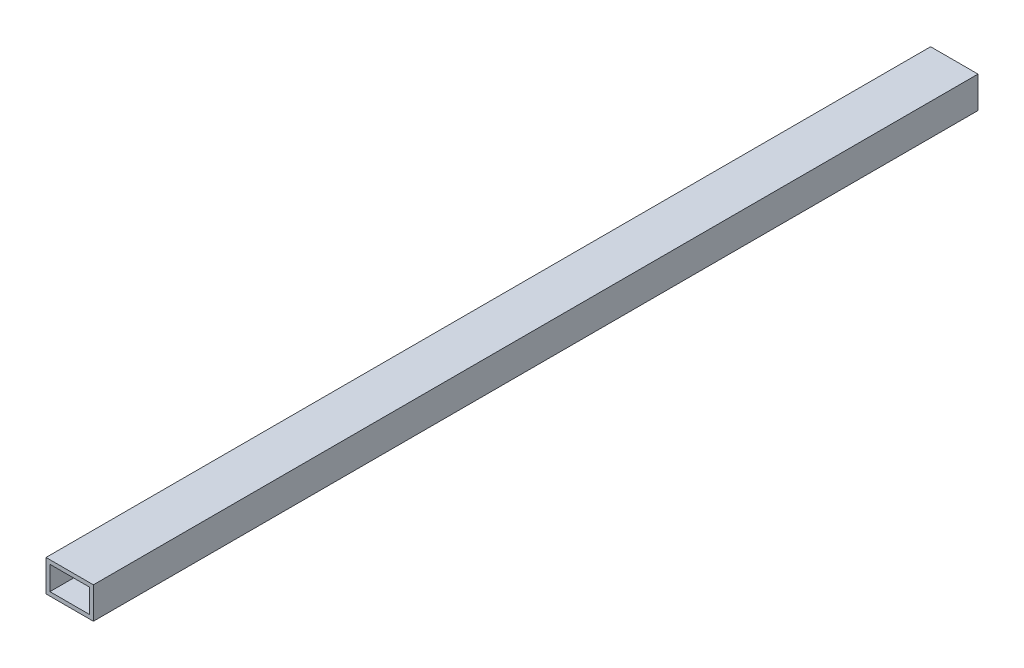
ISO-10303-21;
HEADER;
FILE_DESCRIPTION(('STEP AP214'),'2;1');
FILE_NAME('part.step','',(''),(''),'','','');
FILE_SCHEMA(('AUTOMOTIVE_DESIGN { 1 0 10303 214 1 1 1 1 }'));
ENDSEC;
DATA;
#1=APPLICATION_CONTEXT('core data for automotive mechanical design processes');
#2=APPLICATION_PROTOCOL_DEFINITION('international standard','automotive_design',2000,#1);
#3=PRODUCT_CONTEXT('',#1,'mechanical');
#4=PRODUCT('Part','Part','',(#3));
#5=PRODUCT_RELATED_PRODUCT_CATEGORY('part','',(#4));
#6=PRODUCT_DEFINITION_FORMATION('','',#4);
#7=PRODUCT_DEFINITION_CONTEXT('part definition',#1,'design');
#8=PRODUCT_DEFINITION('design','',#6,#7);
#9=PRODUCT_DEFINITION_SHAPE('','',#8);
#10=(LENGTH_UNIT() NAMED_UNIT(*) SI_UNIT(.MILLI.,.METRE.));
#11=(NAMED_UNIT(*) PLANE_ANGLE_UNIT() SI_UNIT($,.RADIAN.));
#12=(NAMED_UNIT(*) SI_UNIT($,.STERADIAN.) SOLID_ANGLE_UNIT());
#13=UNCERTAINTY_MEASURE_WITH_UNIT(LENGTH_MEASURE(1.E-05),#10,'distance_accuracy_value','');
#14=(GEOMETRIC_REPRESENTATION_CONTEXT(3) GLOBAL_UNCERTAINTY_ASSIGNED_CONTEXT((#13)) GLOBAL_UNIT_ASSIGNED_CONTEXT((#10,
#11,#12)) REPRESENTATION_CONTEXT('',''));
#15=CARTESIAN_POINT('',(0.,0.,0.));
#16=DIRECTION('',(0.,0.,1.));
#17=DIRECTION('',(1.,0.,0.));
#18=AXIS2_PLACEMENT_3D('',#15,#16,#17);
#19=CARTESIAN_POINT('',(19.05,12.7,711.2));
#20=DIRECTION('',(-1.,0.,0.));
#21=DIRECTION('',(0.,-1.,0.));
#22=AXIS2_PLACEMENT_3D('',#19,#20,#21);
#23=PLANE('',#22);
#24=DIRECTION('',(0.,1.,0.));
#25=VECTOR('',#24,1.);
#26=CARTESIAN_POINT('',(19.05,12.7,0.));
#27=LINE('',#26,#25);
#28=CARTESIAN_POINT('',(19.05,-12.7,0.));
#29=VERTEX_POINT('',#28);
#30=CARTESIAN_POINT('',(19.05,12.7,0.));
#31=VERTEX_POINT('',#30);
#32=EDGE_CURVE('E145',#29,#31,#27,.T.);
#33=ORIENTED_EDGE('',*,*,#32,.T.);
#34=DIRECTION('',(0.,0.,-1.));
#35=VECTOR('',#34,1.);
#36=CARTESIAN_POINT('',(19.05,12.7,711.2));
#37=LINE('',#36,#35);
#38=CARTESIAN_POINT('',(19.05,12.7,711.2));
#39=VERTEX_POINT('',#38);
#40=EDGE_CURVE('E11',#39,#31,#37,.T.);
#41=ORIENTED_EDGE('',*,*,#40,.F.);
#42=DIRECTION('',(0.,1.,0.));
#43=VECTOR('',#42,1.);
#44=CARTESIAN_POINT('',(19.05,12.7,711.2));
#45=LINE('',#44,#43);
#46=CARTESIAN_POINT('',(19.05,-12.7,711.2));
#47=VERTEX_POINT('',#46);
#48=EDGE_CURVE('E134',#47,#39,#45,.T.);
#49=ORIENTED_EDGE('',*,*,#48,.F.);
#50=DIRECTION('',(0.,0.,-1.));
#51=VECTOR('',#50,1.);
#52=CARTESIAN_POINT('',(19.05,-12.7,711.2));
#53=LINE('',#52,#51);
#54=EDGE_CURVE('E144',#47,#29,#53,.T.);
#55=ORIENTED_EDGE('',*,*,#54,.T.);
#56=EDGE_LOOP('',(#33,#41,#49,#55));
#57=FACE_BOUND('',#56,.T.);
#58=ADVANCED_FACE('F37',(#57),#23,.F.);
#59=CARTESIAN_POINT('',(-19.05,12.7,711.2));
#60=DIRECTION('',(0.,-1.,0.));
#61=DIRECTION('',(0.,0.,-1.));
#62=AXIS2_PLACEMENT_3D('',#59,#60,#61);
#63=PLANE('',#62);
#64=DIRECTION('',(-1.,0.,0.));
#65=VECTOR('',#64,1.);
#66=CARTESIAN_POINT('',(-19.05,12.7,0.));
#67=LINE('',#66,#65);
#68=CARTESIAN_POINT('',(-19.05,12.7,0.));
#69=VERTEX_POINT('',#68);
#70=EDGE_CURVE('E148',#31,#69,#67,.T.);
#71=ORIENTED_EDGE('',*,*,#70,.T.);
#72=DIRECTION('',(0.,0.,-1.));
#73=VECTOR('',#72,1.);
#74=CARTESIAN_POINT('',(-19.05,12.7,711.2));
#75=LINE('',#74,#73);
#76=CARTESIAN_POINT('',(-19.05,12.7,711.2));
#77=VERTEX_POINT('',#76);
#78=EDGE_CURVE('E44',#77,#69,#75,.T.);
#79=ORIENTED_EDGE('',*,*,#78,.F.);
#80=DIRECTION('',(-1.,0.,0.));
#81=VECTOR('',#80,1.);
#82=CARTESIAN_POINT('',(-19.05,12.7,711.2));
#83=LINE('',#82,#81);
#84=EDGE_CURVE('E137',#39,#77,#83,.T.);
#85=ORIENTED_EDGE('',*,*,#84,.F.);
#86=ORIENTED_EDGE('',*,*,#40,.T.);
#87=EDGE_LOOP('',(#71,#79,#85,#86));
#88=FACE_BOUND('',#87,.T.);
#89=ADVANCED_FACE('F176',(#88),#63,.F.);
#90=CARTESIAN_POINT('',(-19.05,12.7,711.2));
#91=DIRECTION('',(1.,0.,0.));
#92=DIRECTION('',(0.,1.,0.));
#93=AXIS2_PLACEMENT_3D('',#90,#91,#92);
#94=PLANE('',#93);
#95=DIRECTION('',(0.,-1.,0.));
#96=VECTOR('',#95,1.);
#97=CARTESIAN_POINT('',(-19.05,12.7,0.));
#98=LINE('',#97,#96);
#99=CARTESIAN_POINT('',(-19.05,-12.7,0.));
#100=VERTEX_POINT('',#99);
#101=EDGE_CURVE('E150',#69,#100,#98,.T.);
#102=ORIENTED_EDGE('',*,*,#101,.T.);
#103=DIRECTION('',(0.,0.,-1.));
#104=VECTOR('',#103,1.);
#105=CARTESIAN_POINT('',(-19.05,-12.7,711.2));
#106=LINE('',#105,#104);
#107=CARTESIAN_POINT('',(-19.05,-12.7,711.2));
#108=VERTEX_POINT('',#107);
#109=EDGE_CURVE('E155',#108,#100,#106,.T.);
#110=ORIENTED_EDGE('',*,*,#109,.F.);
#111=DIRECTION('',(0.,-1.,0.));
#112=VECTOR('',#111,1.);
#113=CARTESIAN_POINT('',(-19.05,12.7,711.2));
#114=LINE('',#113,#112);
#115=EDGE_CURVE('E140',#77,#108,#114,.T.);
#116=ORIENTED_EDGE('',*,*,#115,.F.);
#117=ORIENTED_EDGE('',*,*,#78,.T.);
#118=EDGE_LOOP('',(#102,#110,#116,#117));
#119=FACE_BOUND('',#118,.T.);
#120=ADVANCED_FACE('F162',(#119),#94,.F.);
#121=CARTESIAN_POINT('',(-19.05,-12.7,711.2));
#122=DIRECTION('',(0.,1.,0.));
#123=DIRECTION('',(0.,0.,1.));
#124=AXIS2_PLACEMENT_3D('',#121,#122,#123);
#125=PLANE('',#124);
#126=DIRECTION('',(1.,0.,0.));
#127=VECTOR('',#126,1.);
#128=CARTESIAN_POINT('',(-19.05,-12.7,0.));
#129=LINE('',#128,#127);
#130=EDGE_CURVE('E138',#100,#29,#129,.T.);
#131=ORIENTED_EDGE('',*,*,#130,.T.);
#132=ORIENTED_EDGE('',*,*,#54,.F.);
#133=DIRECTION('',(1.,0.,0.));
#134=VECTOR('',#133,1.);
#135=CARTESIAN_POINT('',(-19.05,-12.7,711.2));
#136=LINE('',#135,#134);
#137=EDGE_CURVE('E142',#108,#47,#136,.T.);
#138=ORIENTED_EDGE('',*,*,#137,.F.);
#139=ORIENTED_EDGE('',*,*,#109,.T.);
#140=EDGE_LOOP('',(#131,#132,#138,#139));
#141=FACE_BOUND('',#140,.T.);
#142=ADVANCED_FACE('F169',(#141),#125,.F.);
#143=CARTESIAN_POINT('',(0.,0.,711.2));
#144=DIRECTION('',(0.,0.,1.));
#145=DIRECTION('',(1.,0.,0.));
#146=AXIS2_PLACEMENT_3D('',#143,#144,#145);
#147=PLANE('',#146);
#148=DIRECTION('',(0.,1.,0.));
#149=VECTOR('',#148,1.);
#150=CARTESIAN_POINT('',(15.875,12.7,711.2));
#151=LINE('',#150,#149);
#152=CARTESIAN_POINT('',(15.875,-9.525,711.2));
#153=VERTEX_POINT('',#152);
#154=CARTESIAN_POINT('',(15.875,9.525,711.2));
#155=VERTEX_POINT('',#154);
#156=EDGE_CURVE('E122',#153,#155,#151,.T.);
#157=ORIENTED_EDGE('',*,*,#156,.F.);
#158=DIRECTION('',(1.,0.,0.));
#159=VECTOR('',#158,1.);
#160=CARTESIAN_POINT('',(-19.05,-9.525,711.2));
#161=LINE('',#160,#159);
#162=CARTESIAN_POINT('',(-15.875,-9.525,711.2));
#163=VERTEX_POINT('',#162);
#164=EDGE_CURVE('E106',#163,#153,#161,.T.);
#165=ORIENTED_EDGE('',*,*,#164,.F.);
#166=DIRECTION('',(0.,-1.,0.));
#167=VECTOR('',#166,1.);
#168=CARTESIAN_POINT('',(-15.875,12.7,711.2));
#169=LINE('',#168,#167);
#170=CARTESIAN_POINT('',(-15.875,9.525,711.2));
#171=VERTEX_POINT('',#170);
#172=EDGE_CURVE('E131',#171,#163,#169,.T.);
#173=ORIENTED_EDGE('',*,*,#172,.F.);
#174=DIRECTION('',(-1.,0.,0.));
#175=VECTOR('',#174,1.);
#176=CARTESIAN_POINT('',(-19.05,9.525,711.2));
#177=LINE('',#176,#175);
#178=EDGE_CURVE('E124',#155,#171,#177,.T.);
#179=ORIENTED_EDGE('',*,*,#178,.F.);
#180=EDGE_LOOP('',(#157,#165,#173,#179));
#181=FACE_BOUND('',#180,.T.);
#182=ORIENTED_EDGE('',*,*,#48,.T.);
#183=ORIENTED_EDGE('',*,*,#84,.T.);
#184=ORIENTED_EDGE('',*,*,#115,.T.);
#185=ORIENTED_EDGE('',*,*,#137,.T.);
#186=EDGE_LOOP('',(#182,#183,#184,#185));
#187=FACE_BOUND('',#186,.T.);
#188=ADVANCED_FACE('F175',(#181,#187),#147,.T.);
#189=CARTESIAN_POINT('',(0.,0.,0.));
#190=DIRECTION('',(0.,0.,1.));
#191=DIRECTION('',(1.,0.,0.));
#192=AXIS2_PLACEMENT_3D('',#189,#190,#191);
#193=PLANE('',#192);
#194=DIRECTION('',(1.,0.,0.));
#195=VECTOR('',#194,1.);
#196=CARTESIAN_POINT('',(-19.05,-9.525,0.));
#197=LINE('',#196,#195);
#198=CARTESIAN_POINT('',(-15.875,-9.525,0.));
#199=VERTEX_POINT('',#198);
#200=CARTESIAN_POINT('',(15.875,-9.525,0.));
#201=VERTEX_POINT('',#200);
#202=EDGE_CURVE('E104',#199,#201,#197,.T.);
#203=ORIENTED_EDGE('',*,*,#202,.T.);
#204=DIRECTION('',(0.,1.,0.));
#205=VECTOR('',#204,1.);
#206=CARTESIAN_POINT('',(15.875,12.7,0.));
#207=LINE('',#206,#205);
#208=CARTESIAN_POINT('',(15.875,9.525,0.));
#209=VERTEX_POINT('',#208);
#210=EDGE_CURVE('E112',#201,#209,#207,.T.);
#211=ORIENTED_EDGE('',*,*,#210,.T.);
#212=DIRECTION('',(-1.,0.,0.));
#213=VECTOR('',#212,1.);
#214=CARTESIAN_POINT('',(-19.05,9.525,0.));
#215=LINE('',#214,#213);
#216=CARTESIAN_POINT('',(-15.875,9.525,0.));
#217=VERTEX_POINT('',#216);
#218=EDGE_CURVE('E118',#209,#217,#215,.T.);
#219=ORIENTED_EDGE('',*,*,#218,.T.);
#220=DIRECTION('',(0.,-1.,0.));
#221=VECTOR('',#220,1.);
#222=CARTESIAN_POINT('',(-15.875,12.7,0.));
#223=LINE('',#222,#221);
#224=EDGE_CURVE('E58',#217,#199,#223,.T.);
#225=ORIENTED_EDGE('',*,*,#224,.T.);
#226=EDGE_LOOP('',(#203,#211,#219,#225));
#227=FACE_BOUND('',#226,.T.);
#228=ORIENTED_EDGE('',*,*,#32,.F.);
#229=ORIENTED_EDGE('',*,*,#130,.F.);
#230=ORIENTED_EDGE('',*,*,#101,.F.);
#231=ORIENTED_EDGE('',*,*,#70,.F.);
#232=EDGE_LOOP('',(#228,#229,#230,#231));
#233=FACE_BOUND('',#232,.T.);
#234=ADVANCED_FACE('F120',(#227,#233),#193,.F.);
#235=CARTESIAN_POINT('',(15.875,12.7,711.2));
#236=DIRECTION('',(-1.,0.,0.));
#237=DIRECTION('',(0.,-1.,0.));
#238=AXIS2_PLACEMENT_3D('',#235,#236,#237);
#239=PLANE('',#238);
#240=ORIENTED_EDGE('',*,*,#210,.F.);
#241=DIRECTION('',(0.,0.,-1.));
#242=VECTOR('',#241,1.);
#243=CARTESIAN_POINT('',(15.875,-9.525,711.2));
#244=LINE('',#243,#242);
#245=EDGE_CURVE('E100',#153,#201,#244,.T.);
#246=ORIENTED_EDGE('',*,*,#245,.F.);
#247=ORIENTED_EDGE('',*,*,#156,.T.);
#248=DIRECTION('',(0.,0.,-1.));
#249=VECTOR('',#248,1.);
#250=CARTESIAN_POINT('',(15.875,9.525,711.2));
#251=LINE('',#250,#249);
#252=EDGE_CURVE('E115',#155,#209,#251,.T.);
#253=ORIENTED_EDGE('',*,*,#252,.T.);
#254=EDGE_LOOP('',(#240,#246,#247,#253));
#255=FACE_BOUND('',#254,.T.);
#256=ADVANCED_FACE('F113',(#255),#239,.T.);
#257=CARTESIAN_POINT('',(-19.05,9.525,711.2));
#258=DIRECTION('',(0.,-1.,0.));
#259=DIRECTION('',(0.,0.,-1.));
#260=AXIS2_PLACEMENT_3D('',#257,#258,#259);
#261=PLANE('',#260);
#262=ORIENTED_EDGE('',*,*,#218,.F.);
#263=ORIENTED_EDGE('',*,*,#252,.F.);
#264=ORIENTED_EDGE('',*,*,#178,.T.);
#265=DIRECTION('',(0.,0.,-1.));
#266=VECTOR('',#265,1.);
#267=CARTESIAN_POINT('',(-15.875,9.525,711.2));
#268=LINE('',#267,#266);
#269=EDGE_CURVE('E280',#171,#217,#268,.T.);
#270=ORIENTED_EDGE('',*,*,#269,.T.);
#271=EDGE_LOOP('',(#262,#263,#264,#270));
#272=FACE_BOUND('',#271,.T.);
#273=ADVANCED_FACE('F196',(#272),#261,.T.);
#274=CARTESIAN_POINT('',(-15.875,12.7,711.2));
#275=DIRECTION('',(1.,0.,0.));
#276=DIRECTION('',(0.,1.,0.));
#277=AXIS2_PLACEMENT_3D('',#274,#275,#276);
#278=PLANE('',#277);
#279=ORIENTED_EDGE('',*,*,#224,.F.);
#280=ORIENTED_EDGE('',*,*,#269,.F.);
#281=ORIENTED_EDGE('',*,*,#172,.T.);
#282=DIRECTION('',(0.,0.,-1.));
#283=VECTOR('',#282,1.);
#284=CARTESIAN_POINT('',(-15.875,-9.525,711.2));
#285=LINE('',#284,#283);
#286=EDGE_CURVE('E51',#163,#199,#285,.T.);
#287=ORIENTED_EDGE('',*,*,#286,.T.);
#288=EDGE_LOOP('',(#279,#280,#281,#287));
#289=FACE_BOUND('',#288,.T.);
#290=ADVANCED_FACE('F193',(#289),#278,.T.);
#291=CARTESIAN_POINT('',(-19.05,-9.525,711.2));
#292=DIRECTION('',(0.,1.,0.));
#293=DIRECTION('',(0.,0.,1.));
#294=AXIS2_PLACEMENT_3D('',#291,#292,#293);
#295=PLANE('',#294);
#296=ORIENTED_EDGE('',*,*,#202,.F.);
#297=ORIENTED_EDGE('',*,*,#286,.F.);
#298=ORIENTED_EDGE('',*,*,#164,.T.);
#299=ORIENTED_EDGE('',*,*,#245,.T.);
#300=EDGE_LOOP('',(#296,#297,#298,#299));
#301=FACE_BOUND('',#300,.T.);
#302=ADVANCED_FACE('F102',(#301),#295,.T.);
#303=CLOSED_SHELL('',(#58,#89,#120,#142,#188,#234,#256,#273,#290,#302));
#304=MANIFOLD_SOLID_BREP('B2',#303);
#305=ADVANCED_BREP_SHAPE_REPRESENTATION('',(#18,#304),#14);
#306=SHAPE_DEFINITION_REPRESENTATION(#9,#305);
ENDSEC;
END-ISO-10303-21;
